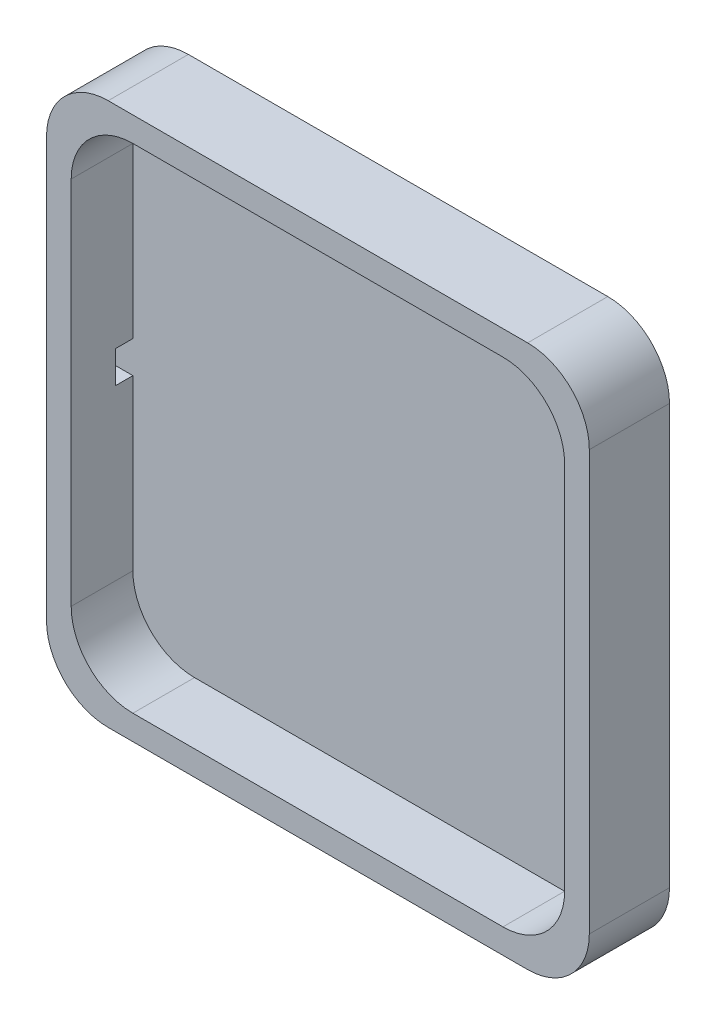
ISO-10303-21;
HEADER;
FILE_DESCRIPTION(('STEP AP214'),'2;1');
FILE_NAME('part.step','',(''),(''),'','','');
FILE_SCHEMA(('AUTOMOTIVE_DESIGN { 1 0 10303 214 1 1 1 1 }'));
ENDSEC;
DATA;
#1=APPLICATION_CONTEXT('core data for automotive mechanical design processes');
#2=APPLICATION_PROTOCOL_DEFINITION('international standard','automotive_design',2000,#1);
#3=PRODUCT_CONTEXT('',#1,'mechanical');
#4=PRODUCT('Part','Part','',(#3));
#5=PRODUCT_RELATED_PRODUCT_CATEGORY('part','',(#4));
#6=PRODUCT_DEFINITION_FORMATION('','',#4);
#7=PRODUCT_DEFINITION_CONTEXT('part definition',#1,'design');
#8=PRODUCT_DEFINITION('design','',#6,#7);
#9=PRODUCT_DEFINITION_SHAPE('','',#8);
#10=(LENGTH_UNIT() NAMED_UNIT(*) SI_UNIT(.MILLI.,.METRE.));
#11=(NAMED_UNIT(*) PLANE_ANGLE_UNIT() SI_UNIT($,.RADIAN.));
#12=(NAMED_UNIT(*) SI_UNIT($,.STERADIAN.) SOLID_ANGLE_UNIT());
#13=UNCERTAINTY_MEASURE_WITH_UNIT(LENGTH_MEASURE(1.E-05),#10,'distance_accuracy_value','');
#14=(GEOMETRIC_REPRESENTATION_CONTEXT(3) GLOBAL_UNCERTAINTY_ASSIGNED_CONTEXT((#13)) GLOBAL_UNIT_ASSIGNED_CONTEXT((#10,
#11,#12)) REPRESENTATION_CONTEXT('',''));
#15=CARTESIAN_POINT('',(0.,0.,0.));
#16=DIRECTION('',(0.,0.,1.));
#17=DIRECTION('',(1.,0.,0.));
#18=AXIS2_PLACEMENT_3D('',#15,#16,#17);
#19=CARTESIAN_POINT('',(17.,17.,1.5));
#20=DIRECTION('',(0.,0.,-1.));
#21=DIRECTION('',(-1.,0.,0.));
#22=AXIS2_PLACEMENT_3D('',#19,#20,#21);
#23=CYLINDRICAL_SURFACE('',#22,5.);
#24=CARTESIAN_POINT('',(17.,17.,0.));
#25=DIRECTION('',(0.,0.,1.));
#26=DIRECTION('',(1.,0.,0.));
#27=AXIS2_PLACEMENT_3D('',#24,#25,#26);
#28=CIRCLE('',#27,5.);
#29=CARTESIAN_POINT('',(22.,17.,0.));
#30=VERTEX_POINT('',#29);
#31=CARTESIAN_POINT('',(17.,22.,0.));
#32=VERTEX_POINT('',#31);
#33=EDGE_CURVE('E291',#30,#32,#28,.T.);
#34=ORIENTED_EDGE('',*,*,#33,.T.);
#35=DIRECTION('',(0.,0.,-1.));
#36=VECTOR('',#35,1.);
#37=CARTESIAN_POINT('',(17.,22.,1.5));
#38=LINE('',#37,#36);
#39=CARTESIAN_POINT('',(17.,22.,6.5));
#40=VERTEX_POINT('',#39);
#41=EDGE_CURVE('E11',#40,#32,#38,.T.);
#42=ORIENTED_EDGE('',*,*,#41,.F.);
#43=CARTESIAN_POINT('',(17.,17.,6.5));
#44=DIRECTION('',(0.,0.,1.));
#45=DIRECTION('',(1.,0.,0.));
#46=AXIS2_PLACEMENT_3D('',#43,#44,#45);
#47=CIRCLE('',#46,4.99999999999999);
#48=CARTESIAN_POINT('',(22.,16.9999999999999,6.5));
#49=VERTEX_POINT('',#48);
#50=EDGE_CURVE('E267',#49,#40,#47,.T.);
#51=ORIENTED_EDGE('',*,*,#50,.F.);
#52=DIRECTION('',(0.,0.,-1.));
#53=VECTOR('',#52,1.);
#54=CARTESIAN_POINT('',(22.,17.,1.5));
#55=LINE('',#54,#53);
#56=EDGE_CURVE('E308',#49,#30,#55,.T.);
#57=ORIENTED_EDGE('',*,*,#56,.T.);
#58=EDGE_LOOP('',(#34,#42,#51,#57));
#59=FACE_BOUND('',#58,.T.);
#60=ADVANCED_FACE('F38',(#59),#23,.T.);
#61=CARTESIAN_POINT('',(-17.,22.,1.5));
#62=DIRECTION('',(0.,-1.,0.));
#63=DIRECTION('',(0.,0.,-1.));
#64=AXIS2_PLACEMENT_3D('',#61,#62,#63);
#65=PLANE('',#64);
#66=DIRECTION('',(-1.,0.,0.));
#67=VECTOR('',#66,1.);
#68=CARTESIAN_POINT('',(-17.,22.,0.));
#69=LINE('',#68,#67);
#70=CARTESIAN_POINT('',(-17.,22.,0.));
#71=VERTEX_POINT('',#70);
#72=EDGE_CURVE('E294',#32,#71,#69,.T.);
#73=ORIENTED_EDGE('',*,*,#72,.T.);
#74=DIRECTION('',(0.,0.,-1.));
#75=VECTOR('',#74,1.);
#76=CARTESIAN_POINT('',(-17.,22.,1.5));
#77=LINE('',#76,#75);
#78=CARTESIAN_POINT('',(-17.,22.,6.5));
#79=VERTEX_POINT('',#78);
#80=EDGE_CURVE('E45',#79,#71,#77,.T.);
#81=ORIENTED_EDGE('',*,*,#80,.F.);
#82=DIRECTION('',(-1.,0.,0.));
#83=VECTOR('',#82,1.);
#84=CARTESIAN_POINT('',(-17.,22.,6.5));
#85=LINE('',#84,#83);
#86=EDGE_CURVE('E270',#40,#79,#85,.T.);
#87=ORIENTED_EDGE('',*,*,#86,.F.);
#88=ORIENTED_EDGE('',*,*,#41,.T.);
#89=EDGE_LOOP('',(#73,#81,#87,#88));
#90=FACE_BOUND('',#89,.T.);
#91=ADVANCED_FACE('F358',(#90),#65,.F.);
#92=CARTESIAN_POINT('',(-17.,17.,1.5));
#93=DIRECTION('',(0.,0.,-1.));
#94=DIRECTION('',(-1.,0.,0.));
#95=AXIS2_PLACEMENT_3D('',#92,#93,#94);
#96=CYLINDRICAL_SURFACE('',#95,5.);
#97=CARTESIAN_POINT('',(-17.,17.,0.));
#98=DIRECTION('',(0.,0.,1.));
#99=DIRECTION('',(1.,0.,0.));
#100=AXIS2_PLACEMENT_3D('',#97,#98,#99);
#101=CIRCLE('',#100,5.);
#102=CARTESIAN_POINT('',(-22.,17.,0.));
#103=VERTEX_POINT('',#102);
#104=EDGE_CURVE('E296',#71,#103,#101,.T.);
#105=ORIENTED_EDGE('',*,*,#104,.T.);
#106=DIRECTION('',(0.,0.,-1.));
#107=VECTOR('',#106,1.);
#108=CARTESIAN_POINT('',(-22.,17.,1.5));
#109=LINE('',#108,#107);
#110=CARTESIAN_POINT('',(-22.,16.9999999999999,6.5));
#111=VERTEX_POINT('',#110);
#112=EDGE_CURVE('E323',#111,#103,#109,.T.);
#113=ORIENTED_EDGE('',*,*,#112,.F.);
#114=CARTESIAN_POINT('',(-17.,17.,6.5));
#115=DIRECTION('',(0.,0.,1.));
#116=DIRECTION('',(1.,0.,0.));
#117=AXIS2_PLACEMENT_3D('',#114,#115,#116);
#118=CIRCLE('',#117,4.99999999999999);
#119=EDGE_CURVE('E273',#79,#111,#118,.T.);
#120=ORIENTED_EDGE('',*,*,#119,.F.);
#121=ORIENTED_EDGE('',*,*,#80,.T.);
#122=EDGE_LOOP('',(#105,#113,#120,#121));
#123=FACE_BOUND('',#122,.T.);
#124=ADVANCED_FACE('F329',(#123),#96,.T.);
#125=CARTESIAN_POINT('',(-22.,17.,1.5));
#126=DIRECTION('',(1.,0.,0.));
#127=DIRECTION('',(0.,1.,0.));
#128=AXIS2_PLACEMENT_3D('',#125,#126,#127);
#129=PLANE('',#128);
#130=DIRECTION('',(0.,1.,0.));
#131=VECTOR('',#130,1.);
#132=CARTESIAN_POINT('',(-22.,1.3,1.5));
#133=LINE('',#132,#131);
#134=CARTESIAN_POINT('',(-22.,-1.3,1.5));
#135=VERTEX_POINT('',#134);
#136=CARTESIAN_POINT('',(-22.,1.3,1.5));
#137=VERTEX_POINT('',#136);
#138=EDGE_CURVE('E185',#135,#137,#133,.T.);
#139=ORIENTED_EDGE('',*,*,#138,.T.);
#140=DIRECTION('',(0.,0.,1.));
#141=VECTOR('',#140,1.);
#142=CARTESIAN_POINT('',(-22.,1.3,1.5));
#143=LINE('',#142,#141);
#144=CARTESIAN_POINT('',(-22.,1.3,2.9));
#145=VERTEX_POINT('',#144);
#146=EDGE_CURVE('E177',#137,#145,#143,.T.);
#147=ORIENTED_EDGE('',*,*,#146,.T.);
#148=DIRECTION('',(0.,-1.,0.));
#149=VECTOR('',#148,1.);
#150=CARTESIAN_POINT('',(-22.,1.3,2.9));
#151=LINE('',#150,#149);
#152=CARTESIAN_POINT('',(-22.,-1.3,2.9));
#153=VERTEX_POINT('',#152);
#154=EDGE_CURVE('E188',#145,#153,#151,.T.);
#155=ORIENTED_EDGE('',*,*,#154,.T.);
#156=DIRECTION('',(0.,0.,-1.));
#157=VECTOR('',#156,1.);
#158=CARTESIAN_POINT('',(-22.,-1.3,2.9));
#159=LINE('',#158,#157);
#160=EDGE_CURVE('E52',#153,#135,#159,.T.);
#161=ORIENTED_EDGE('',*,*,#160,.T.);
#162=EDGE_LOOP('',(#139,#147,#155,#161));
#163=FACE_BOUND('',#162,.T.);
#164=DIRECTION('',(0.,-1.,0.));
#165=VECTOR('',#164,1.);
#166=CARTESIAN_POINT('',(-22.,17.,0.));
#167=LINE('',#166,#165);
#168=CARTESIAN_POINT('',(-22.,-17.,0.));
#169=VERTEX_POINT('',#168);
#170=EDGE_CURVE('E298',#103,#169,#167,.T.);
#171=ORIENTED_EDGE('',*,*,#170,.T.);
#172=DIRECTION('',(0.,0.,-1.));
#173=VECTOR('',#172,1.);
#174=CARTESIAN_POINT('',(-22.,-17.,1.5));
#175=LINE('',#174,#173);
#176=CARTESIAN_POINT('',(-22.,-17.,6.5));
#177=VERTEX_POINT('',#176);
#178=EDGE_CURVE('E320',#177,#169,#175,.T.);
#179=ORIENTED_EDGE('',*,*,#178,.F.);
#180=DIRECTION('',(0.,-1.,0.));
#181=VECTOR('',#180,1.);
#182=CARTESIAN_POINT('',(-22.,16.9999999999999,6.5));
#183=LINE('',#182,#181);
#184=EDGE_CURVE('E276',#111,#177,#183,.T.);
#185=ORIENTED_EDGE('',*,*,#184,.F.);
#186=ORIENTED_EDGE('',*,*,#112,.T.);
#187=EDGE_LOOP('',(#171,#179,#185,#186));
#188=FACE_BOUND('',#187,.T.);
#189=ADVANCED_FACE('F192',(#163,#188),#129,.F.);
#190=CARTESIAN_POINT('',(-17.,-17.,1.5));
#191=DIRECTION('',(0.,0.,-1.));
#192=DIRECTION('',(-1.,0.,0.));
#193=AXIS2_PLACEMENT_3D('',#190,#191,#192);
#194=CYLINDRICAL_SURFACE('',#193,5.);
#195=CARTESIAN_POINT('',(-17.,-17.,0.));
#196=DIRECTION('',(0.,0.,1.));
#197=DIRECTION('',(-1.,0.,0.));
#198=AXIS2_PLACEMENT_3D('',#195,#196,#197);
#199=CIRCLE('',#198,5.);
#200=CARTESIAN_POINT('',(-17.,-22.,0.));
#201=VERTEX_POINT('',#200);
#202=EDGE_CURVE('E300',#169,#201,#199,.T.);
#203=ORIENTED_EDGE('',*,*,#202,.T.);
#204=DIRECTION('',(0.,0.,-1.));
#205=VECTOR('',#204,1.);
#206=CARTESIAN_POINT('',(-17.,-22.,1.5));
#207=LINE('',#206,#205);
#208=CARTESIAN_POINT('',(-17.,-22.,6.5));
#209=VERTEX_POINT('',#208);
#210=EDGE_CURVE('E317',#209,#201,#207,.T.);
#211=ORIENTED_EDGE('',*,*,#210,.F.);
#212=CARTESIAN_POINT('',(-17.,-17.,6.5));
#213=DIRECTION('',(0.,0.,1.));
#214=DIRECTION('',(-1.,0.,0.));
#215=AXIS2_PLACEMENT_3D('',#212,#213,#214);
#216=CIRCLE('',#215,5.);
#217=EDGE_CURVE('E279',#177,#209,#216,.T.);
#218=ORIENTED_EDGE('',*,*,#217,.F.);
#219=ORIENTED_EDGE('',*,*,#178,.T.);
#220=EDGE_LOOP('',(#203,#211,#218,#219));
#221=FACE_BOUND('',#220,.T.);
#222=ADVANCED_FACE('F341',(#221),#194,.T.);
#223=CARTESIAN_POINT('',(-17.,-22.,1.5));
#224=DIRECTION('',(0.,1.,0.));
#225=DIRECTION('',(0.,0.,1.));
#226=AXIS2_PLACEMENT_3D('',#223,#224,#225);
#227=PLANE('',#226);
#228=DIRECTION('',(1.,0.,0.));
#229=VECTOR('',#228,1.);
#230=CARTESIAN_POINT('',(-17.,-22.,0.));
#231=LINE('',#230,#229);
#232=CARTESIAN_POINT('',(17.,-22.,0.));
#233=VERTEX_POINT('',#232);
#234=EDGE_CURVE('E302',#201,#233,#231,.T.);
#235=ORIENTED_EDGE('',*,*,#234,.T.);
#236=DIRECTION('',(0.,0.,-1.));
#237=VECTOR('',#236,1.);
#238=CARTESIAN_POINT('',(17.,-22.,1.5));
#239=LINE('',#238,#237);
#240=CARTESIAN_POINT('',(17.,-22.,6.5));
#241=VERTEX_POINT('',#240);
#242=EDGE_CURVE('E314',#241,#233,#239,.T.);
#243=ORIENTED_EDGE('',*,*,#242,.F.);
#244=DIRECTION('',(1.,0.,0.));
#245=VECTOR('',#244,1.);
#246=CARTESIAN_POINT('',(-17.,-22.,6.5));
#247=LINE('',#246,#245);
#248=EDGE_CURVE('E282',#209,#241,#247,.T.);
#249=ORIENTED_EDGE('',*,*,#248,.F.);
#250=ORIENTED_EDGE('',*,*,#210,.T.);
#251=EDGE_LOOP('',(#235,#243,#249,#250));
#252=FACE_BOUND('',#251,.T.);
#253=ADVANCED_FACE('F348',(#252),#227,.F.);
#254=CARTESIAN_POINT('',(17.,-17.,1.5));
#255=DIRECTION('',(0.,0.,-1.));
#256=DIRECTION('',(-1.,0.,0.));
#257=AXIS2_PLACEMENT_3D('',#254,#255,#256);
#258=CYLINDRICAL_SURFACE('',#257,5.);
#259=CARTESIAN_POINT('',(17.,-17.,0.));
#260=DIRECTION('',(0.,0.,1.));
#261=DIRECTION('',(-1.,0.,0.));
#262=AXIS2_PLACEMENT_3D('',#259,#260,#261);
#263=CIRCLE('',#262,5.);
#264=CARTESIAN_POINT('',(22.,-17.,0.));
#265=VERTEX_POINT('',#264);
#266=EDGE_CURVE('E304',#233,#265,#263,.T.);
#267=ORIENTED_EDGE('',*,*,#266,.T.);
#268=DIRECTION('',(0.,0.,-1.));
#269=VECTOR('',#268,1.);
#270=CARTESIAN_POINT('',(22.,-17.,1.5));
#271=LINE('',#270,#269);
#272=CARTESIAN_POINT('',(22.,-17.,6.5));
#273=VERTEX_POINT('',#272);
#274=EDGE_CURVE('E311',#273,#265,#271,.T.);
#275=ORIENTED_EDGE('',*,*,#274,.F.);
#276=CARTESIAN_POINT('',(17.,-17.,6.5));
#277=DIRECTION('',(0.,0.,1.));
#278=DIRECTION('',(-1.,0.,0.));
#279=AXIS2_PLACEMENT_3D('',#276,#277,#278);
#280=CIRCLE('',#279,5.);
#281=EDGE_CURVE('E285',#241,#273,#280,.T.);
#282=ORIENTED_EDGE('',*,*,#281,.F.);
#283=ORIENTED_EDGE('',*,*,#242,.T.);
#284=EDGE_LOOP('',(#267,#275,#282,#283));
#285=FACE_BOUND('',#284,.T.);
#286=ADVANCED_FACE('F351',(#285),#258,.T.);
#287=CARTESIAN_POINT('',(22.,17.,1.5));
#288=DIRECTION('',(-1.,0.,0.));
#289=DIRECTION('',(0.,-1.,0.));
#290=AXIS2_PLACEMENT_3D('',#287,#288,#289);
#291=PLANE('',#290);
#292=DIRECTION('',(0.,1.,0.));
#293=VECTOR('',#292,1.);
#294=CARTESIAN_POINT('',(22.,17.,0.));
#295=LINE('',#294,#293);
#296=EDGE_CURVE('E306',#265,#30,#295,.T.);
#297=ORIENTED_EDGE('',*,*,#296,.T.);
#298=ORIENTED_EDGE('',*,*,#56,.F.);
#299=DIRECTION('',(0.,1.,0.));
#300=VECTOR('',#299,1.);
#301=CARTESIAN_POINT('',(22.,16.9999999999999,6.5));
#302=LINE('',#301,#300);
#303=EDGE_CURVE('E288',#273,#49,#302,.T.);
#304=ORIENTED_EDGE('',*,*,#303,.F.);
#305=ORIENTED_EDGE('',*,*,#274,.T.);
#306=EDGE_LOOP('',(#297,#298,#304,#305));
#307=FACE_BOUND('',#306,.T.);
#308=ADVANCED_FACE('F354',(#307),#291,.F.);
#309=CARTESIAN_POINT('',(17.,17.,0.));
#310=DIRECTION('',(0.,0.,1.));
#311=DIRECTION('',(1.,0.,0.));
#312=AXIS2_PLACEMENT_3D('',#309,#310,#311);
#313=PLANE('',#312);
#314=ORIENTED_EDGE('',*,*,#33,.F.);
#315=ORIENTED_EDGE('',*,*,#296,.F.);
#316=ORIENTED_EDGE('',*,*,#266,.F.);
#317=ORIENTED_EDGE('',*,*,#234,.F.);
#318=ORIENTED_EDGE('',*,*,#202,.F.);
#319=ORIENTED_EDGE('',*,*,#170,.F.);
#320=ORIENTED_EDGE('',*,*,#104,.F.);
#321=ORIENTED_EDGE('',*,*,#72,.F.);
#322=EDGE_LOOP('',(#314,#315,#316,#317,#318,#319,#320,#321));
#323=FACE_BOUND('',#322,.T.);
#324=ADVANCED_FACE('F335',(#323),#313,.F.);
#325=CARTESIAN_POINT('',(17.,17.,6.5));
#326=DIRECTION('',(0.,0.,1.));
#327=DIRECTION('',(1.,0.,0.));
#328=AXIS2_PLACEMENT_3D('',#325,#326,#327);
#329=PLANE('',#328);
#330=ORIENTED_EDGE('',*,*,#50,.T.);
#331=ORIENTED_EDGE('',*,*,#86,.T.);
#332=ORIENTED_EDGE('',*,*,#119,.T.);
#333=ORIENTED_EDGE('',*,*,#184,.T.);
#334=ORIENTED_EDGE('',*,*,#217,.T.);
#335=ORIENTED_EDGE('',*,*,#248,.T.);
#336=ORIENTED_EDGE('',*,*,#281,.T.);
#337=ORIENTED_EDGE('',*,*,#303,.T.);
#338=EDGE_LOOP('',(#330,#331,#332,#333,#334,#335,#336,#337));
#339=FACE_BOUND('',#338,.T.);
#340=DIRECTION('',(-1.,0.,0.));
#341=VECTOR('',#340,1.);
#342=CARTESIAN_POINT('',(-15.,20.,6.5));
#343=LINE('',#342,#341);
#344=CARTESIAN_POINT('',(14.9999999999999,20.,6.5));
#345=VERTEX_POINT('',#344);
#346=CARTESIAN_POINT('',(-15.,20.,6.5));
#347=VERTEX_POINT('',#346);
#348=EDGE_CURVE('E211',#345,#347,#343,.T.);
#349=ORIENTED_EDGE('',*,*,#348,.F.);
#350=CARTESIAN_POINT('',(15.,15.,6.5));
#351=DIRECTION('',(0.,0.,1.));
#352=DIRECTION('',(1.,0.,0.));
#353=AXIS2_PLACEMENT_3D('',#350,#351,#352);
#354=CIRCLE('',#353,5.);
#355=CARTESIAN_POINT('',(20.,14.9999999999999,6.5));
#356=VERTEX_POINT('',#355);
#357=EDGE_CURVE('E209',#356,#345,#354,.T.);
#358=ORIENTED_EDGE('',*,*,#357,.F.);
#359=DIRECTION('',(0.,1.,0.));
#360=VECTOR('',#359,1.);
#361=CARTESIAN_POINT('',(20.,14.9999999999999,6.5));
#362=LINE('',#361,#360);
#363=CARTESIAN_POINT('',(20.,-15.,6.5));
#364=VERTEX_POINT('',#363);
#365=EDGE_CURVE('E225',#364,#356,#362,.T.);
#366=ORIENTED_EDGE('',*,*,#365,.F.);
#367=CARTESIAN_POINT('',(15.,-15.,6.5));
#368=DIRECTION('',(0.,0.,1.));
#369=DIRECTION('',(1.,0.,0.));
#370=AXIS2_PLACEMENT_3D('',#367,#368,#369);
#371=CIRCLE('',#370,5.);
#372=CARTESIAN_POINT('',(14.9999999999999,-20.,6.5));
#373=VERTEX_POINT('',#372);
#374=EDGE_CURVE('E222',#373,#364,#371,.T.);
#375=ORIENTED_EDGE('',*,*,#374,.F.);
#376=DIRECTION('',(1.,0.,0.));
#377=VECTOR('',#376,1.);
#378=CARTESIAN_POINT('',(14.9999999999999,-20.,6.5));
#379=LINE('',#378,#377);
#380=CARTESIAN_POINT('',(-15.,-20.,6.5));
#381=VERTEX_POINT('',#380);
#382=EDGE_CURVE('E220',#381,#373,#379,.T.);
#383=ORIENTED_EDGE('',*,*,#382,.F.);
#384=CARTESIAN_POINT('',(-15.,-15.,6.5));
#385=DIRECTION('',(0.,0.,1.));
#386=DIRECTION('',(1.,0.,0.));
#387=AXIS2_PLACEMENT_3D('',#384,#385,#386);
#388=CIRCLE('',#387,5.);
#389=CARTESIAN_POINT('',(-20.,-15.,6.5));
#390=VERTEX_POINT('',#389);
#391=EDGE_CURVE('E218',#390,#381,#388,.T.);
#392=ORIENTED_EDGE('',*,*,#391,.F.);
#393=DIRECTION('',(0.,-1.,0.));
#394=VECTOR('',#393,1.);
#395=CARTESIAN_POINT('',(-20.,-15.,6.5));
#396=LINE('',#395,#394);
#397=CARTESIAN_POINT('',(-20.,14.9999999999999,6.5));
#398=VERTEX_POINT('',#397);
#399=EDGE_CURVE('E216',#398,#390,#396,.T.);
#400=ORIENTED_EDGE('',*,*,#399,.F.);
#401=CARTESIAN_POINT('',(-15.,15.,6.5));
#402=DIRECTION('',(0.,0.,1.));
#403=DIRECTION('',(-1.,0.,0.));
#404=AXIS2_PLACEMENT_3D('',#401,#402,#403);
#405=CIRCLE('',#404,5.);
#406=EDGE_CURVE('E214',#347,#398,#405,.T.);
#407=ORIENTED_EDGE('',*,*,#406,.F.);
#408=EDGE_LOOP('',(#349,#358,#366,#375,#383,#392,#400,#407));
#409=FACE_BOUND('',#408,.T.);
#410=ADVANCED_FACE('F344',(#339,#409),#329,.T.);
#411=CARTESIAN_POINT('',(15.,15.,6.5));
#412=DIRECTION('',(0.,0.,-1.));
#413=DIRECTION('',(-1.,0.,0.));
#414=AXIS2_PLACEMENT_3D('',#411,#412,#413);
#415=CYLINDRICAL_SURFACE('',#414,5.);
#416=CARTESIAN_POINT('',(15.,15.,1.5));
#417=DIRECTION('',(0.,0.,1.));
#418=DIRECTION('',(1.,0.,0.));
#419=AXIS2_PLACEMENT_3D('',#416,#417,#418);
#420=CIRCLE('',#419,5.);
#421=CARTESIAN_POINT('',(20.,14.9999999999999,1.5));
#422=VERTEX_POINT('',#421);
#423=CARTESIAN_POINT('',(14.9999999999999,20.,1.5));
#424=VERTEX_POINT('',#423);
#425=EDGE_CURVE('E205',#422,#424,#420,.T.);
#426=ORIENTED_EDGE('',*,*,#425,.F.);
#427=DIRECTION('',(0.,0.,-1.));
#428=VECTOR('',#427,1.);
#429=CARTESIAN_POINT('',(20.,14.9999999999999,6.5));
#430=LINE('',#429,#428);
#431=EDGE_CURVE('E227',#356,#422,#430,.T.);
#432=ORIENTED_EDGE('',*,*,#431,.F.);
#433=ORIENTED_EDGE('',*,*,#357,.T.);
#434=DIRECTION('',(0.,0.,-1.));
#435=VECTOR('',#434,1.);
#436=CARTESIAN_POINT('',(14.9999999999999,20.,6.5));
#437=LINE('',#436,#435);
#438=EDGE_CURVE('E264',#345,#424,#437,.T.);
#439=ORIENTED_EDGE('',*,*,#438,.T.);
#440=EDGE_LOOP('',(#426,#432,#433,#439));
#441=FACE_BOUND('',#440,.T.);
#442=ADVANCED_FACE('F385',(#441),#415,.F.);
#443=CARTESIAN_POINT('',(-15.,20.,6.5));
#444=DIRECTION('',(0.,-1.,0.));
#445=DIRECTION('',(0.,0.,-1.));
#446=AXIS2_PLACEMENT_3D('',#443,#444,#445);
#447=PLANE('',#446);
#448=DIRECTION('',(-1.,0.,0.));
#449=VECTOR('',#448,1.);
#450=CARTESIAN_POINT('',(-15.,20.,1.5));
#451=LINE('',#450,#449);
#452=CARTESIAN_POINT('',(-15.,20.,1.5));
#453=VERTEX_POINT('',#452);
#454=EDGE_CURVE('E229',#424,#453,#451,.T.);
#455=ORIENTED_EDGE('',*,*,#454,.F.);
#456=ORIENTED_EDGE('',*,*,#438,.F.);
#457=ORIENTED_EDGE('',*,*,#348,.T.);
#458=DIRECTION('',(0.,0.,-1.));
#459=VECTOR('',#458,1.);
#460=CARTESIAN_POINT('',(-15.,20.,6.5));
#461=LINE('',#460,#459);
#462=EDGE_CURVE('E261',#347,#453,#461,.T.);
#463=ORIENTED_EDGE('',*,*,#462,.T.);
#464=EDGE_LOOP('',(#455,#456,#457,#463));
#465=FACE_BOUND('',#464,.T.);
#466=ADVANCED_FACE('F388',(#465),#447,.T.);
#467=CARTESIAN_POINT('',(-15.,15.,6.5));
#468=DIRECTION('',(0.,0.,-1.));
#469=DIRECTION('',(-1.,0.,0.));
#470=AXIS2_PLACEMENT_3D('',#467,#468,#469);
#471=CYLINDRICAL_SURFACE('',#470,5.);
#472=CARTESIAN_POINT('',(-15.,15.,1.5));
#473=DIRECTION('',(0.,0.,1.));
#474=DIRECTION('',(-1.,0.,0.));
#475=AXIS2_PLACEMENT_3D('',#472,#473,#474);
#476=CIRCLE('',#475,5.);
#477=CARTESIAN_POINT('',(-20.,14.9999999999999,1.5));
#478=VERTEX_POINT('',#477);
#479=EDGE_CURVE('E231',#453,#478,#476,.T.);
#480=ORIENTED_EDGE('',*,*,#479,.F.);
#481=ORIENTED_EDGE('',*,*,#462,.F.);
#482=ORIENTED_EDGE('',*,*,#406,.T.);
#483=DIRECTION('',(0.,0.,-1.));
#484=VECTOR('',#483,1.);
#485=CARTESIAN_POINT('',(-20.,14.9999999999999,6.5));
#486=LINE('',#485,#484);
#487=EDGE_CURVE('E258',#398,#478,#486,.T.);
#488=ORIENTED_EDGE('',*,*,#487,.T.);
#489=EDGE_LOOP('',(#480,#481,#482,#488));
#490=FACE_BOUND('',#489,.T.);
#491=ADVANCED_FACE('F392',(#490),#471,.F.);
#492=CARTESIAN_POINT('',(-20.,-15.,6.5));
#493=DIRECTION('',(1.,0.,0.));
#494=DIRECTION('',(0.,0.,-1.));
#495=AXIS2_PLACEMENT_3D('',#492,#493,#494);
#496=PLANE('',#495);
#497=DIRECTION('',(0.,0.,1.));
#498=VECTOR('',#497,1.);
#499=CARTESIAN_POINT('',(-20.,1.3,1.5));
#500=LINE('',#499,#498);
#501=CARTESIAN_POINT('',(-20.,1.3,1.5));
#502=VERTEX_POINT('',#501);
#503=CARTESIAN_POINT('',(-20.,1.3,2.9));
#504=VERTEX_POINT('',#503);
#505=EDGE_CURVE('E180',#502,#504,#500,.T.);
#506=ORIENTED_EDGE('',*,*,#505,.F.);
#507=DIRECTION('',(0.,-1.,0.));
#508=VECTOR('',#507,1.);
#509=CARTESIAN_POINT('',(-20.,-15.,1.5));
#510=LINE('',#509,#508);
#511=EDGE_CURVE('E234',#478,#502,#510,.T.);
#512=ORIENTED_EDGE('',*,*,#511,.F.);
#513=ORIENTED_EDGE('',*,*,#487,.F.);
#514=ORIENTED_EDGE('',*,*,#399,.T.);
#515=DIRECTION('',(0.,0.,-1.));
#516=VECTOR('',#515,1.);
#517=CARTESIAN_POINT('',(-20.,-15.,6.5));
#518=LINE('',#517,#516);
#519=CARTESIAN_POINT('',(-20.,-15.,1.5));
#520=VERTEX_POINT('',#519);
#521=EDGE_CURVE('E255',#390,#520,#518,.T.);
#522=ORIENTED_EDGE('',*,*,#521,.T.);
#523=CARTESIAN_POINT('',(-20.,-1.3,1.5));
#524=VERTEX_POINT('',#523);
#525=EDGE_CURVE('E233',#524,#520,#510,.T.);
#526=ORIENTED_EDGE('',*,*,#525,.F.);
#527=DIRECTION('',(0.,0.,-1.));
#528=VECTOR('',#527,1.);
#529=CARTESIAN_POINT('',(-20.,-1.3,2.9));
#530=LINE('',#529,#528);
#531=CARTESIAN_POINT('',(-20.,-1.3,2.9));
#532=VERTEX_POINT('',#531);
#533=EDGE_CURVE('E57',#532,#524,#530,.T.);
#534=ORIENTED_EDGE('',*,*,#533,.F.);
#535=DIRECTION('',(0.,-1.,0.));
#536=VECTOR('',#535,1.);
#537=CARTESIAN_POINT('',(-20.,1.3,2.9));
#538=LINE('',#537,#536);
#539=EDGE_CURVE('E196',#504,#532,#538,.T.);
#540=ORIENTED_EDGE('',*,*,#539,.F.);
#541=EDGE_LOOP('',(#506,#512,#513,#514,#522,#526,#534,#540));
#542=FACE_BOUND('',#541,.T.);
#543=ADVANCED_FACE('F396',(#542),#496,.T.);
#544=CARTESIAN_POINT('',(-15.,-15.,6.5));
#545=DIRECTION('',(0.,0.,-1.));
#546=DIRECTION('',(-1.,0.,0.));
#547=AXIS2_PLACEMENT_3D('',#544,#545,#546);
#548=CYLINDRICAL_SURFACE('',#547,5.);
#549=CARTESIAN_POINT('',(-15.,-15.,1.5));
#550=DIRECTION('',(0.,0.,1.));
#551=DIRECTION('',(1.,0.,0.));
#552=AXIS2_PLACEMENT_3D('',#549,#550,#551);
#553=CIRCLE('',#552,5.);
#554=CARTESIAN_POINT('',(-15.,-20.,1.5));
#555=VERTEX_POINT('',#554);
#556=EDGE_CURVE('E237',#520,#555,#553,.T.);
#557=ORIENTED_EDGE('',*,*,#556,.F.);
#558=ORIENTED_EDGE('',*,*,#521,.F.);
#559=ORIENTED_EDGE('',*,*,#391,.T.);
#560=DIRECTION('',(0.,0.,-1.));
#561=VECTOR('',#560,1.);
#562=CARTESIAN_POINT('',(-15.,-20.,6.5));
#563=LINE('',#562,#561);
#564=EDGE_CURVE('E252',#381,#555,#563,.T.);
#565=ORIENTED_EDGE('',*,*,#564,.T.);
#566=EDGE_LOOP('',(#557,#558,#559,#565));
#567=FACE_BOUND('',#566,.T.);
#568=ADVANCED_FACE('F400',(#567),#548,.F.);
#569=CARTESIAN_POINT('',(14.9999999999999,-20.,6.5));
#570=DIRECTION('',(0.,1.,0.));
#571=DIRECTION('',(0.,0.,1.));
#572=AXIS2_PLACEMENT_3D('',#569,#570,#571);
#573=PLANE('',#572);
#574=DIRECTION('',(1.,0.,0.));
#575=VECTOR('',#574,1.);
#576=CARTESIAN_POINT('',(14.9999999999999,-20.,1.5));
#577=LINE('',#576,#575);
#578=CARTESIAN_POINT('',(14.9999999999999,-20.,1.5));
#579=VERTEX_POINT('',#578);
#580=EDGE_CURVE('E239',#555,#579,#577,.T.);
#581=ORIENTED_EDGE('',*,*,#580,.F.);
#582=ORIENTED_EDGE('',*,*,#564,.F.);
#583=ORIENTED_EDGE('',*,*,#382,.T.);
#584=DIRECTION('',(0.,0.,-1.));
#585=VECTOR('',#584,1.);
#586=CARTESIAN_POINT('',(14.9999999999999,-20.,6.5));
#587=LINE('',#586,#585);
#588=EDGE_CURVE('E249',#373,#579,#587,.T.);
#589=ORIENTED_EDGE('',*,*,#588,.T.);
#590=EDGE_LOOP('',(#581,#582,#583,#589));
#591=FACE_BOUND('',#590,.T.);
#592=ADVANCED_FACE('F404',(#591),#573,.T.);
#593=CARTESIAN_POINT('',(15.,-15.,6.5));
#594=DIRECTION('',(0.,0.,-1.));
#595=DIRECTION('',(-1.,0.,0.));
#596=AXIS2_PLACEMENT_3D('',#593,#594,#595);
#597=CYLINDRICAL_SURFACE('',#596,5.);
#598=CARTESIAN_POINT('',(15.,-15.,1.5));
#599=DIRECTION('',(0.,0.,1.));
#600=DIRECTION('',(1.,0.,0.));
#601=AXIS2_PLACEMENT_3D('',#598,#599,#600);
#602=CIRCLE('',#601,5.);
#603=CARTESIAN_POINT('',(20.,-15.,1.5));
#604=VERTEX_POINT('',#603);
#605=EDGE_CURVE('E241',#579,#604,#602,.T.);
#606=ORIENTED_EDGE('',*,*,#605,.F.);
#607=ORIENTED_EDGE('',*,*,#588,.F.);
#608=ORIENTED_EDGE('',*,*,#374,.T.);
#609=DIRECTION('',(0.,0.,-1.));
#610=VECTOR('',#609,1.);
#611=CARTESIAN_POINT('',(20.,-15.,6.5));
#612=LINE('',#611,#610);
#613=EDGE_CURVE('E246',#364,#604,#612,.T.);
#614=ORIENTED_EDGE('',*,*,#613,.T.);
#615=EDGE_LOOP('',(#606,#607,#608,#614));
#616=FACE_BOUND('',#615,.T.);
#617=ADVANCED_FACE('F408',(#616),#597,.F.);
#618=CARTESIAN_POINT('',(20.,14.9999999999999,6.5));
#619=DIRECTION('',(-1.,0.,0.));
#620=DIRECTION('',(0.,0.,1.));
#621=AXIS2_PLACEMENT_3D('',#618,#619,#620);
#622=PLANE('',#621);
#623=DIRECTION('',(0.,1.,0.));
#624=VECTOR('',#623,1.);
#625=CARTESIAN_POINT('',(20.,14.9999999999999,1.5));
#626=LINE('',#625,#624);
#627=EDGE_CURVE('E212',#604,#422,#626,.T.);
#628=ORIENTED_EDGE('',*,*,#627,.F.);
#629=ORIENTED_EDGE('',*,*,#613,.F.);
#630=ORIENTED_EDGE('',*,*,#365,.T.);
#631=ORIENTED_EDGE('',*,*,#431,.T.);
#632=EDGE_LOOP('',(#628,#629,#630,#631));
#633=FACE_BOUND('',#632,.T.);
#634=ADVANCED_FACE('F381',(#633),#622,.T.);
#635=CARTESIAN_POINT('',(17.,17.,1.5));
#636=DIRECTION('',(0.,0.,1.));
#637=DIRECTION('',(1.,0.,0.));
#638=AXIS2_PLACEMENT_3D('',#635,#636,#637);
#639=PLANE('',#638);
#640=ORIENTED_EDGE('',*,*,#425,.T.);
#641=ORIENTED_EDGE('',*,*,#454,.T.);
#642=ORIENTED_EDGE('',*,*,#479,.T.);
#643=ORIENTED_EDGE('',*,*,#511,.T.);
#644=DIRECTION('',(1.,0.,0.));
#645=VECTOR('',#644,1.);
#646=CARTESIAN_POINT('',(-22.,1.3,1.5));
#647=LINE('',#646,#645);
#648=EDGE_CURVE('E203',#137,#502,#647,.T.);
#649=ORIENTED_EDGE('',*,*,#648,.F.);
#650=ORIENTED_EDGE('',*,*,#138,.F.);
#651=DIRECTION('',(1.,0.,0.));
#652=VECTOR('',#651,1.);
#653=CARTESIAN_POINT('',(-22.,-1.3,1.5));
#654=LINE('',#653,#652);
#655=EDGE_CURVE('E206',#135,#524,#654,.T.);
#656=ORIENTED_EDGE('',*,*,#655,.T.);
#657=ORIENTED_EDGE('',*,*,#525,.T.);
#658=ORIENTED_EDGE('',*,*,#556,.T.);
#659=ORIENTED_EDGE('',*,*,#580,.T.);
#660=ORIENTED_EDGE('',*,*,#605,.T.);
#661=ORIENTED_EDGE('',*,*,#627,.T.);
#662=EDGE_LOOP('',(#640,#641,#642,#643,#649,#650,#656,#657,#658,#659,#660,#661));
#663=FACE_BOUND('',#662,.T.);
#664=ADVANCED_FACE('F378',(#663),#639,.T.);
#665=CARTESIAN_POINT('',(-22.,1.3,1.5));
#666=DIRECTION('',(0.,1.,0.));
#667=DIRECTION('',(0.,0.,1.));
#668=AXIS2_PLACEMENT_3D('',#665,#666,#667);
#669=PLANE('',#668);
#670=ORIENTED_EDGE('',*,*,#505,.T.);
#671=DIRECTION('',(1.,0.,0.));
#672=VECTOR('',#671,1.);
#673=CARTESIAN_POINT('',(-22.,1.3,2.9));
#674=LINE('',#673,#672);
#675=EDGE_CURVE('E173',#145,#504,#674,.T.);
#676=ORIENTED_EDGE('',*,*,#675,.F.);
#677=ORIENTED_EDGE('',*,*,#146,.F.);
#678=ORIENTED_EDGE('',*,*,#648,.T.);
#679=EDGE_LOOP('',(#670,#676,#677,#678));
#680=FACE_BOUND('',#679,.T.);
#681=ADVANCED_FACE('F175',(#680),#669,.F.);
#682=CARTESIAN_POINT('',(-22.,-1.3,2.9));
#683=DIRECTION('',(0.,-1.,0.));
#684=DIRECTION('',(0.,0.,-1.));
#685=AXIS2_PLACEMENT_3D('',#682,#683,#684);
#686=PLANE('',#685);
#687=ORIENTED_EDGE('',*,*,#533,.T.);
#688=ORIENTED_EDGE('',*,*,#655,.F.);
#689=ORIENTED_EDGE('',*,*,#160,.F.);
#690=DIRECTION('',(1.,0.,0.));
#691=VECTOR('',#690,1.);
#692=CARTESIAN_POINT('',(-22.,-1.3,2.9));
#693=LINE('',#692,#691);
#694=EDGE_CURVE('E184',#153,#532,#693,.T.);
#695=ORIENTED_EDGE('',*,*,#694,.T.);
#696=EDGE_LOOP('',(#687,#688,#689,#695));
#697=FACE_BOUND('',#696,.T.);
#698=ADVANCED_FACE('F418',(#697),#686,.F.);
#699=CARTESIAN_POINT('',(-22.,1.3,2.9));
#700=DIRECTION('',(0.,0.,1.));
#701=DIRECTION('',(0.,-1.,0.));
#702=AXIS2_PLACEMENT_3D('',#699,#700,#701);
#703=PLANE('',#702);
#704=ORIENTED_EDGE('',*,*,#539,.T.);
#705=ORIENTED_EDGE('',*,*,#694,.F.);
#706=ORIENTED_EDGE('',*,*,#154,.F.);
#707=ORIENTED_EDGE('',*,*,#675,.T.);
#708=EDGE_LOOP('',(#704,#705,#706,#707));
#709=FACE_BOUND('',#708,.T.);
#710=ADVANCED_FACE('F189',(#709),#703,.F.);
#711=CLOSED_SHELL('',(#60,#91,#124,#189,#222,#253,#286,#308,#324,#410,#442,#466,#491,#543,#568,
#592,#617,#634,#664,#681,#698,#710));
#712=MANIFOLD_SOLID_BREP('B2',#711);
#713=ADVANCED_BREP_SHAPE_REPRESENTATION('',(#18,#712),#14);
#714=SHAPE_DEFINITION_REPRESENTATION(#9,#713);
ENDSEC;
END-ISO-10303-21;
